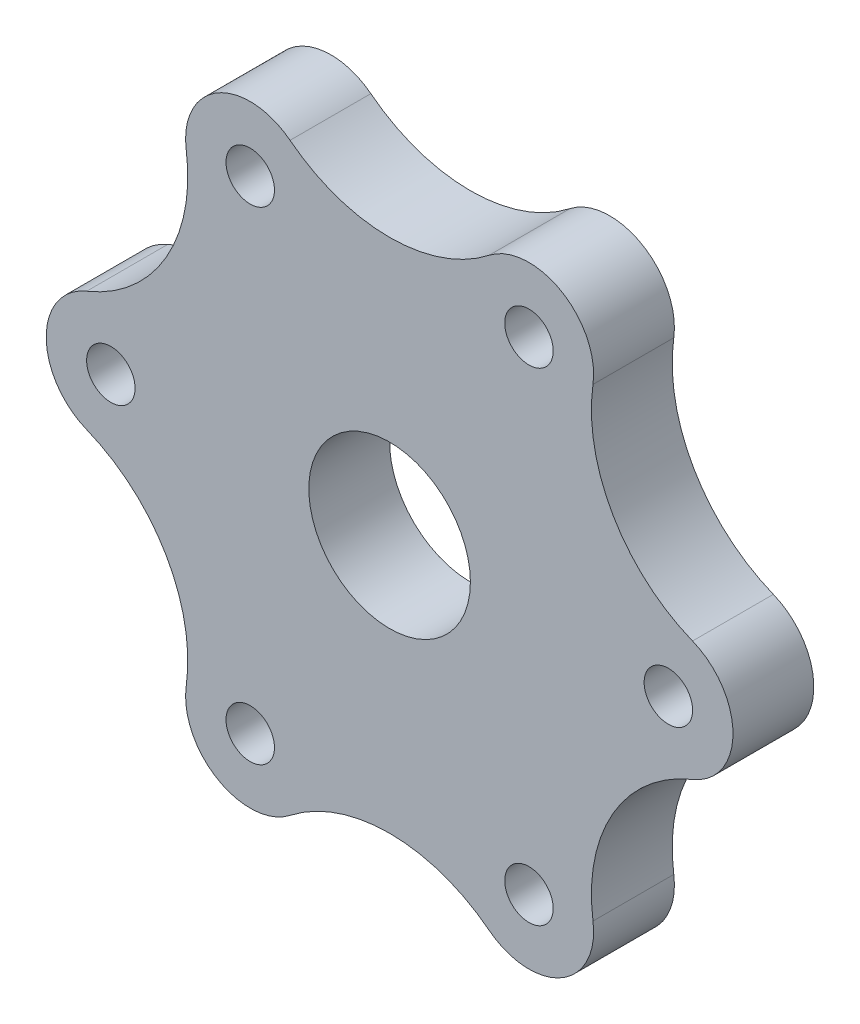
ISO-10303-21;
HEADER;
FILE_DESCRIPTION(('STEP AP214'),'2;1');
FILE_NAME('part.step','',(''),(''),'','','');
FILE_SCHEMA(('AUTOMOTIVE_DESIGN { 1 0 10303 214 1 1 1 1 }'));
ENDSEC;
DATA;
#1=APPLICATION_CONTEXT('core data for automotive mechanical design processes');
#2=APPLICATION_PROTOCOL_DEFINITION('international standard','automotive_design',2000,#1);
#3=PRODUCT_CONTEXT('',#1,'mechanical');
#4=PRODUCT('Part','Part','',(#3));
#5=PRODUCT_RELATED_PRODUCT_CATEGORY('part','',(#4));
#6=PRODUCT_DEFINITION_FORMATION('','',#4);
#7=PRODUCT_DEFINITION_CONTEXT('part definition',#1,'design');
#8=PRODUCT_DEFINITION('design','',#6,#7);
#9=PRODUCT_DEFINITION_SHAPE('','',#8);
#10=(LENGTH_UNIT() NAMED_UNIT(*) SI_UNIT(.MILLI.,.METRE.));
#11=(NAMED_UNIT(*) PLANE_ANGLE_UNIT() SI_UNIT($,.RADIAN.));
#12=(NAMED_UNIT(*) SI_UNIT($,.STERADIAN.) SOLID_ANGLE_UNIT());
#13=UNCERTAINTY_MEASURE_WITH_UNIT(LENGTH_MEASURE(1.E-05),#10,'distance_accuracy_value','');
#14=(GEOMETRIC_REPRESENTATION_CONTEXT(3) GLOBAL_UNCERTAINTY_ASSIGNED_CONTEXT((#13)) GLOBAL_UNIT_ASSIGNED_CONTEXT((#10,
#11,#12)) REPRESENTATION_CONTEXT('',''));
#15=CARTESIAN_POINT('',(0.,0.,0.));
#16=DIRECTION('',(0.,0.,1.));
#17=DIRECTION('',(1.,0.,0.));
#18=AXIS2_PLACEMENT_3D('',#15,#16,#17);
#19=CARTESIAN_POINT('',(8.62499999999937,40.9055405077826,5.));
#20=DIRECTION('',(0.,0.,1.));
#21=DIRECTION('',(1.,0.,0.));
#22=AXIS2_PLACEMENT_3D('',#19,#20,#21);
#23=PLANE('',#22);
#24=CARTESIAN_POINT('',(17.2499999999997,-29.8778764305633,5.));
#25=DIRECTION('',(0.,0.,1.));
#26=DIRECTION('',(1.,0.,0.));
#27=AXIS2_PLACEMENT_3D('',#24,#25,#26);
#28=CIRCLE('',#27,3.);
#29=CARTESIAN_POINT('',(20.2499999999997,-29.8778764305633,5.));
#30=VERTEX_POINT('',#29);
#31=EDGE_CURVE('E348',#30,#30,#28,.T.);
#32=ORIENTED_EDGE('',*,*,#31,.F.);
#33=EDGE_LOOP('',(#32));
#34=FACE_BOUND('',#33,.T.);
#35=CARTESIAN_POINT('',(17.2500000000001,29.8778764305631,5.));
#36=DIRECTION('',(0.,0.,1.));
#37=DIRECTION('',(1.,0.,0.));
#38=AXIS2_PLACEMENT_3D('',#35,#36,#37);
#39=CIRCLE('',#38,3.);
#40=CARTESIAN_POINT('',(20.2500000000001,29.8778764305631,5.));
#41=VERTEX_POINT('',#40);
#42=EDGE_CURVE('E364',#41,#41,#39,.T.);
#43=ORIENTED_EDGE('',*,*,#42,.F.);
#44=EDGE_LOOP('',(#43));
#45=FACE_BOUND('',#44,.T.);
#46=CARTESIAN_POINT('',(-34.5,0.,5.));
#47=DIRECTION('',(0.,0.,1.));
#48=DIRECTION('',(1.,0.,0.));
#49=AXIS2_PLACEMENT_3D('',#46,#47,#48);
#50=CIRCLE('',#49,3.);
#51=CARTESIAN_POINT('',(-31.5,0.,5.));
#52=VERTEX_POINT('',#51);
#53=EDGE_CURVE('E380',#52,#52,#50,.T.);
#54=ORIENTED_EDGE('',*,*,#53,.F.);
#55=EDGE_LOOP('',(#54));
#56=FACE_BOUND('',#55,.T.);
#57=CARTESIAN_POINT('',(-1.39788676991777E-12,51.9332045850022,5.));
#58=DIRECTION('',(0.,0.,-1.));
#59=DIRECTION('',(1.,0.,0.));
#60=AXIS2_PLACEMENT_3D('',#57,#58,#59);
#61=CIRCLE('',#60,20.);
#62=CARTESIAN_POINT('',(12.3214285714275,36.1793987604023,5.));
#63=VERTEX_POINT('',#62);
#64=CARTESIAN_POINT('',(-12.3214285714296,36.1793987604032,5.));
#65=VERTEX_POINT('',#64);
#66=EDGE_CURVE('E204',#63,#65,#61,.T.);
#67=ORIENTED_EDGE('',*,*,#66,.T.);
#68=CARTESIAN_POINT('',(-17.2499999999999,29.8778764305632,5.));
#69=DIRECTION('',(0.,0.,1.));
#70=DIRECTION('',(1.,0.,0.));
#71=AXIS2_PLACEMENT_3D('',#68,#69,#70);
#72=CIRCLE('',#71,7.99999999999949);
#73=CARTESIAN_POINT('',(-25.1715641344413,28.7603695339741,5.));
#74=VERTEX_POINT('',#73);
#75=EDGE_CURVE('E116',#65,#74,#72,.T.);
#76=ORIENTED_EDGE('',*,*,#75,.T.);
#77=CARTESIAN_POINT('',(-44.9754744705465,25.9666022925012,5.));
#78=DIRECTION('',(0.,0.,-1.));
#79=DIRECTION('',(1.,0.,0.));
#80=AXIS2_PLACEMENT_3D('',#77,#78,#79);
#81=CIRCLE('',#80,20.);
#82=CARTESIAN_POINT('',(-37.4929927058704,7.4190292264289,5.));
#83=VERTEX_POINT('',#82);
#84=EDGE_CURVE('E241',#74,#83,#81,.T.);
#85=ORIENTED_EDGE('',*,*,#84,.T.);
#86=CARTESIAN_POINT('',(-34.5,0.,5.));
#87=DIRECTION('',(0.,0.,1.));
#88=DIRECTION('',(1.,0.,0.));
#89=AXIS2_PLACEMENT_3D('',#86,#87,#88);
#90=CIRCLE('',#89,7.99999999999932);
#91=CARTESIAN_POINT('',(-37.4929927058702,-7.41902922642828,5.));
#92=VERTEX_POINT('',#91);
#93=EDGE_CURVE('E261',#83,#92,#90,.T.);
#94=ORIENTED_EDGE('',*,*,#93,.T.);
#95=CARTESIAN_POINT('',(-44.975474470546,-25.9666022924999,5.));
#96=DIRECTION('',(0.,0.,-1.));
#97=DIRECTION('',(1.,0.,0.));
#98=AXIS2_PLACEMENT_3D('',#95,#96,#97);
#99=CIRCLE('',#98,20.);
#100=CARTESIAN_POINT('',(-25.1715641344413,-28.7603695339727,5.));
#101=VERTEX_POINT('',#100);
#102=EDGE_CURVE('E257',#92,#101,#99,.T.);
#103=ORIENTED_EDGE('',*,*,#102,.T.);
#104=CARTESIAN_POINT('',(-17.2500000000004,-29.8778764305629,5.));
#105=DIRECTION('',(0.,0.,1.));
#106=DIRECTION('',(1.,0.,0.));
#107=AXIS2_PLACEMENT_3D('',#104,#105,#106);
#108=CIRCLE('',#107,7.99999999999981);
#109=CARTESIAN_POINT('',(-12.3214285714289,-36.1793987604025,5.));
#110=VERTEX_POINT('',#109);
#111=EDGE_CURVE('E260',#101,#110,#108,.T.);
#112=ORIENTED_EDGE('',*,*,#111,.T.);
#113=CARTESIAN_POINT('',(0.,-51.9332045850024,5.));
#114=DIRECTION('',(0.,0.,-1.));
#115=DIRECTION('',(1.,0.,0.));
#116=AXIS2_PLACEMENT_3D('',#113,#114,#115);
#117=CIRCLE('',#116,20.);
#118=CARTESIAN_POINT('',(12.3214285714286,-36.1793987604029,5.));
#119=VERTEX_POINT('',#118);
#120=EDGE_CURVE('E265',#110,#119,#117,.T.);
#121=ORIENTED_EDGE('',*,*,#120,.T.);
#122=CARTESIAN_POINT('',(17.2499999999997,-29.8778764305633,5.));
#123=DIRECTION('',(0.,0.,1.));
#124=DIRECTION('',(1.,0.,0.));
#125=AXIS2_PLACEMENT_3D('',#122,#123,#124);
#126=CIRCLE('',#125,7.99999999999999);
#127=CARTESIAN_POINT('',(25.1715641344416,-28.760369533974,5.));
#128=VERTEX_POINT('',#127);
#129=EDGE_CURVE('E272',#119,#128,#126,.T.);
#130=ORIENTED_EDGE('',*,*,#129,.T.);
#131=CARTESIAN_POINT('',(44.9754744705466,-25.9666022925011,5.));
#132=DIRECTION('',(0.,0.,-1.));
#133=DIRECTION('',(1.,0.,0.));
#134=AXIS2_PLACEMENT_3D('',#131,#132,#133);
#135=CIRCLE('',#134,20.);
#136=CARTESIAN_POINT('',(37.4929927058705,-7.41902922642887,5.));
#137=VERTEX_POINT('',#136);
#138=EDGE_CURVE('E147',#128,#137,#135,.T.);
#139=ORIENTED_EDGE('',*,*,#138,.T.);
#140=CARTESIAN_POINT('',(34.5,-2.40912212380176E-13,5.));
#141=DIRECTION('',(0.,0.,1.));
#142=DIRECTION('',(1.,0.,0.));
#143=AXIS2_PLACEMENT_3D('',#140,#141,#142);
#144=CIRCLE('',#143,8.00000000000001);
#145=CARTESIAN_POINT('',(37.4929927058703,7.41902922642871,5.));
#146=VERTEX_POINT('',#145);
#147=EDGE_CURVE('E141',#137,#146,#144,.T.);
#148=ORIENTED_EDGE('',*,*,#147,.T.);
#149=CARTESIAN_POINT('',(44.9754744705465,25.9666022925012,5.));
#150=DIRECTION('',(0.,0.,-1.));
#151=DIRECTION('',(1.,0.,0.));
#152=AXIS2_PLACEMENT_3D('',#149,#150,#151);
#153=CIRCLE('',#152,20.);
#154=CARTESIAN_POINT('',(25.1715641344419,28.760369533974,5.));
#155=VERTEX_POINT('',#154);
#156=EDGE_CURVE('E145',#146,#155,#153,.T.);
#157=ORIENTED_EDGE('',*,*,#156,.T.);
#158=CARTESIAN_POINT('',(17.2500000000001,29.8778764305631,5.));
#159=DIRECTION('',(0.,0.,1.));
#160=DIRECTION('',(1.,0.,0.));
#161=AXIS2_PLACEMENT_3D('',#158,#159,#160);
#162=CIRCLE('',#161,8.00000000000034);
#163=EDGE_CURVE('E61',#155,#63,#162,.T.);
#164=ORIENTED_EDGE('',*,*,#163,.T.);
#165=EDGE_LOOP('',(#67,#76,#85,#94,#103,#112,#121,#130,#139,#148,#157,#164));
#166=FACE_BOUND('',#165,.T.);
#167=CARTESIAN_POINT('',(0.,0.,5.));
#168=DIRECTION('',(0.,0.,1.));
#169=DIRECTION('',(1.,0.,0.));
#170=AXIS2_PLACEMENT_3D('',#167,#168,#169);
#171=CIRCLE('',#170,10.);
#172=CARTESIAN_POINT('',(10.,0.,5.));
#173=VERTEX_POINT('',#172);
#174=EDGE_CURVE('E174',#173,#173,#171,.T.);
#175=ORIENTED_EDGE('',*,*,#174,.F.);
#176=EDGE_LOOP('',(#175));
#177=FACE_BOUND('',#176,.T.);
#178=CARTESIAN_POINT('',(-17.25,29.8778764305631,5.));
#179=DIRECTION('',(0.,0.,1.));
#180=DIRECTION('',(1.,0.,0.));
#181=AXIS2_PLACEMENT_3D('',#178,#179,#180);
#182=CIRCLE('',#181,3.00000000000003);
#183=CARTESIAN_POINT('',(-14.25,29.8778764305631,5.));
#184=VERTEX_POINT('',#183);
#185=EDGE_CURVE('E372',#184,#184,#182,.T.);
#186=ORIENTED_EDGE('',*,*,#185,.F.);
#187=EDGE_LOOP('',(#186));
#188=FACE_BOUND('',#187,.T.);
#189=CARTESIAN_POINT('',(34.5,-2.40912212380176E-13,5.));
#190=DIRECTION('',(0.,0.,1.));
#191=DIRECTION('',(1.,0.,0.));
#192=AXIS2_PLACEMENT_3D('',#189,#190,#191);
#193=CIRCLE('',#192,3.);
#194=CARTESIAN_POINT('',(37.5,-2.40912212380176E-13,5.));
#195=VERTEX_POINT('',#194);
#196=EDGE_CURVE('E356',#195,#195,#193,.T.);
#197=ORIENTED_EDGE('',*,*,#196,.F.);
#198=EDGE_LOOP('',(#197));
#199=FACE_BOUND('',#198,.T.);
#200=CARTESIAN_POINT('',(-17.25,-29.8778764305631,5.));
#201=DIRECTION('',(0.,0.,1.));
#202=DIRECTION('',(1.,0.,0.));
#203=AXIS2_PLACEMENT_3D('',#200,#201,#202);
#204=CIRCLE('',#203,3.00000000000013);
#205=CARTESIAN_POINT('',(-14.2499999999998,-29.8778764305631,5.));
#206=VERTEX_POINT('',#205);
#207=EDGE_CURVE('E337',#206,#206,#204,.T.);
#208=ORIENTED_EDGE('',*,*,#207,.F.);
#209=EDGE_LOOP('',(#208));
#210=FACE_BOUND('',#209,.T.);
#211=ADVANCED_FACE('F43',(#34,#45,#56,#166,#177,#188,#199,#210),#23,.T.);
#212=CARTESIAN_POINT('',(8.62499999999937,40.9055405077826,-5.));
#213=DIRECTION('',(0.,0.,1.));
#214=DIRECTION('',(1.,0.,0.));
#215=AXIS2_PLACEMENT_3D('',#212,#213,#214);
#216=PLANE('',#215);
#217=CARTESIAN_POINT('',(-1.39788676991777E-12,51.9332045850022,-5.));
#218=DIRECTION('',(0.,0.,-1.));
#219=DIRECTION('',(1.,0.,0.));
#220=AXIS2_PLACEMENT_3D('',#217,#218,#219);
#221=CIRCLE('',#220,20.);
#222=CARTESIAN_POINT('',(12.3214285714275,36.1793987604023,-5.));
#223=VERTEX_POINT('',#222);
#224=CARTESIAN_POINT('',(-12.3214285714296,36.1793987604032,-5.));
#225=VERTEX_POINT('',#224);
#226=EDGE_CURVE('E169',#223,#225,#221,.T.);
#227=ORIENTED_EDGE('',*,*,#226,.F.);
#228=CARTESIAN_POINT('',(17.2500000000001,29.8778764305631,-5.));
#229=DIRECTION('',(0.,0.,1.));
#230=DIRECTION('',(1.,0.,0.));
#231=AXIS2_PLACEMENT_3D('',#228,#229,#230);
#232=CIRCLE('',#231,8.00000000000034);
#233=CARTESIAN_POINT('',(25.1715641344419,28.760369533974,-5.));
#234=VERTEX_POINT('',#233);
#235=EDGE_CURVE('E108',#234,#223,#232,.T.);
#236=ORIENTED_EDGE('',*,*,#235,.F.);
#237=CARTESIAN_POINT('',(44.9754744705465,25.9666022925012,-5.));
#238=DIRECTION('',(0.,0.,-1.));
#239=DIRECTION('',(1.,0.,0.));
#240=AXIS2_PLACEMENT_3D('',#237,#238,#239);
#241=CIRCLE('',#240,20.);
#242=CARTESIAN_POINT('',(37.4929927058703,7.41902922642871,-5.));
#243=VERTEX_POINT('',#242);
#244=EDGE_CURVE('E102',#243,#234,#241,.T.);
#245=ORIENTED_EDGE('',*,*,#244,.F.);
#246=CARTESIAN_POINT('',(34.5,-2.40912212380176E-13,-5.));
#247=DIRECTION('',(0.,0.,1.));
#248=DIRECTION('',(1.,0.,0.));
#249=AXIS2_PLACEMENT_3D('',#246,#247,#248);
#250=CIRCLE('',#249,8.00000000000001);
#251=CARTESIAN_POINT('',(37.4929927058705,-7.41902922642887,-5.));
#252=VERTEX_POINT('',#251);
#253=EDGE_CURVE('E156',#252,#243,#250,.T.);
#254=ORIENTED_EDGE('',*,*,#253,.F.);
#255=CARTESIAN_POINT('',(44.9754744705466,-25.9666022925011,-5.));
#256=DIRECTION('',(0.,0.,-1.));
#257=DIRECTION('',(1.,0.,0.));
#258=AXIS2_PLACEMENT_3D('',#255,#256,#257);
#259=CIRCLE('',#258,20.);
#260=CARTESIAN_POINT('',(25.1715641344416,-28.760369533974,-5.));
#261=VERTEX_POINT('',#260);
#262=EDGE_CURVE('E195',#261,#252,#259,.T.);
#263=ORIENTED_EDGE('',*,*,#262,.F.);
#264=CARTESIAN_POINT('',(17.2499999999997,-29.8778764305633,-5.));
#265=DIRECTION('',(0.,0.,1.));
#266=DIRECTION('',(1.,0.,0.));
#267=AXIS2_PLACEMENT_3D('',#264,#265,#266);
#268=CIRCLE('',#267,7.99999999999999);
#269=CARTESIAN_POINT('',(12.3214285714286,-36.1793987604029,-5.));
#270=VERTEX_POINT('',#269);
#271=EDGE_CURVE('E192',#270,#261,#268,.T.);
#272=ORIENTED_EDGE('',*,*,#271,.F.);
#273=CARTESIAN_POINT('',(0.,-51.9332045850024,-5.));
#274=DIRECTION('',(0.,0.,-1.));
#275=DIRECTION('',(1.,0.,0.));
#276=AXIS2_PLACEMENT_3D('',#273,#274,#275);
#277=CIRCLE('',#276,20.);
#278=CARTESIAN_POINT('',(-12.3214285714289,-36.1793987604025,-5.));
#279=VERTEX_POINT('',#278);
#280=EDGE_CURVE('E189',#279,#270,#277,.T.);
#281=ORIENTED_EDGE('',*,*,#280,.F.);
#282=CARTESIAN_POINT('',(-17.2500000000004,-29.8778764305629,-5.));
#283=DIRECTION('',(0.,0.,1.));
#284=DIRECTION('',(1.,0.,0.));
#285=AXIS2_PLACEMENT_3D('',#282,#283,#284);
#286=CIRCLE('',#285,7.99999999999981);
#287=CARTESIAN_POINT('',(-25.1715641344413,-28.7603695339727,-5.));
#288=VERTEX_POINT('',#287);
#289=EDGE_CURVE('E186',#288,#279,#286,.T.);
#290=ORIENTED_EDGE('',*,*,#289,.F.);
#291=CARTESIAN_POINT('',(-44.975474470546,-25.9666022924999,-5.));
#292=DIRECTION('',(0.,0.,-1.));
#293=DIRECTION('',(1.,0.,0.));
#294=AXIS2_PLACEMENT_3D('',#291,#292,#293);
#295=CIRCLE('',#294,20.);
#296=CARTESIAN_POINT('',(-37.4929927058702,-7.41902922642828,-5.));
#297=VERTEX_POINT('',#296);
#298=EDGE_CURVE('E183',#297,#288,#295,.T.);
#299=ORIENTED_EDGE('',*,*,#298,.F.);
#300=CARTESIAN_POINT('',(-34.5,0.,-5.));
#301=DIRECTION('',(0.,0.,1.));
#302=DIRECTION('',(1.,0.,0.));
#303=AXIS2_PLACEMENT_3D('',#300,#301,#302);
#304=CIRCLE('',#303,7.99999999999932);
#305=CARTESIAN_POINT('',(-37.4929927058704,7.4190292264289,-5.));
#306=VERTEX_POINT('',#305);
#307=EDGE_CURVE('E180',#306,#297,#304,.T.);
#308=ORIENTED_EDGE('',*,*,#307,.F.);
#309=CARTESIAN_POINT('',(-44.9754744705465,25.9666022925012,-5.));
#310=DIRECTION('',(0.,0.,-1.));
#311=DIRECTION('',(1.,0.,0.));
#312=AXIS2_PLACEMENT_3D('',#309,#310,#311);
#313=CIRCLE('',#312,20.);
#314=CARTESIAN_POINT('',(-25.1715641344413,28.7603695339741,-5.));
#315=VERTEX_POINT('',#314);
#316=EDGE_CURVE('E177',#315,#306,#313,.T.);
#317=ORIENTED_EDGE('',*,*,#316,.F.);
#318=CARTESIAN_POINT('',(-17.2499999999999,29.8778764305632,-5.));
#319=DIRECTION('',(0.,0.,1.));
#320=DIRECTION('',(1.,0.,0.));
#321=AXIS2_PLACEMENT_3D('',#318,#319,#320);
#322=CIRCLE('',#321,7.99999999999949);
#323=EDGE_CURVE('E173',#225,#315,#322,.T.);
#324=ORIENTED_EDGE('',*,*,#323,.F.);
#325=EDGE_LOOP('',(#227,#236,#245,#254,#263,#272,#281,#290,#299,#308,#317,#324));
#326=FACE_BOUND('',#325,.T.);
#327=CARTESIAN_POINT('',(0.,0.,-5.));
#328=DIRECTION('',(0.,0.,1.));
#329=DIRECTION('',(1.,0.,0.));
#330=AXIS2_PLACEMENT_3D('',#327,#328,#329);
#331=CIRCLE('',#330,10.);
#332=CARTESIAN_POINT('',(10.,0.,-5.));
#333=VERTEX_POINT('',#332);
#334=EDGE_CURVE('E384',#333,#333,#331,.T.);
#335=ORIENTED_EDGE('',*,*,#334,.T.);
#336=EDGE_LOOP('',(#335));
#337=FACE_BOUND('',#336,.T.);
#338=CARTESIAN_POINT('',(-34.5,0.,-5.));
#339=DIRECTION('',(0.,0.,1.));
#340=DIRECTION('',(1.,0.,0.));
#341=AXIS2_PLACEMENT_3D('',#338,#339,#340);
#342=CIRCLE('',#341,3.);
#343=CARTESIAN_POINT('',(-31.5,0.,-5.));
#344=VERTEX_POINT('',#343);
#345=EDGE_CURVE('E376',#344,#344,#342,.T.);
#346=ORIENTED_EDGE('',*,*,#345,.T.);
#347=EDGE_LOOP('',(#346));
#348=FACE_BOUND('',#347,.T.);
#349=CARTESIAN_POINT('',(-17.25,29.8778764305631,-5.));
#350=DIRECTION('',(0.,0.,1.));
#351=DIRECTION('',(1.,0.,0.));
#352=AXIS2_PLACEMENT_3D('',#349,#350,#351);
#353=CIRCLE('',#352,3.00000000000003);
#354=CARTESIAN_POINT('',(-14.25,29.8778764305631,-5.));
#355=VERTEX_POINT('',#354);
#356=EDGE_CURVE('E368',#355,#355,#353,.T.);
#357=ORIENTED_EDGE('',*,*,#356,.T.);
#358=EDGE_LOOP('',(#357));
#359=FACE_BOUND('',#358,.T.);
#360=CARTESIAN_POINT('',(17.2500000000001,29.8778764305631,-5.));
#361=DIRECTION('',(0.,0.,1.));
#362=DIRECTION('',(1.,0.,0.));
#363=AXIS2_PLACEMENT_3D('',#360,#361,#362);
#364=CIRCLE('',#363,3.);
#365=CARTESIAN_POINT('',(20.2500000000001,29.8778764305631,-5.));
#366=VERTEX_POINT('',#365);
#367=EDGE_CURVE('E360',#366,#366,#364,.T.);
#368=ORIENTED_EDGE('',*,*,#367,.T.);
#369=EDGE_LOOP('',(#368));
#370=FACE_BOUND('',#369,.T.);
#371=CARTESIAN_POINT('',(34.5,-2.40912212380176E-13,-5.));
#372=DIRECTION('',(0.,0.,1.));
#373=DIRECTION('',(1.,0.,0.));
#374=AXIS2_PLACEMENT_3D('',#371,#372,#373);
#375=CIRCLE('',#374,3.);
#376=CARTESIAN_POINT('',(37.5,-2.40912212380176E-13,-5.));
#377=VERTEX_POINT('',#376);
#378=EDGE_CURVE('E352',#377,#377,#375,.T.);
#379=ORIENTED_EDGE('',*,*,#378,.T.);
#380=EDGE_LOOP('',(#379));
#381=FACE_BOUND('',#380,.T.);
#382=CARTESIAN_POINT('',(17.2499999999997,-29.8778764305633,-5.));
#383=DIRECTION('',(0.,0.,1.));
#384=DIRECTION('',(1.,0.,0.));
#385=AXIS2_PLACEMENT_3D('',#382,#383,#384);
#386=CIRCLE('',#385,3.);
#387=CARTESIAN_POINT('',(20.2499999999997,-29.8778764305633,-5.));
#388=VERTEX_POINT('',#387);
#389=EDGE_CURVE('E345',#388,#388,#386,.T.);
#390=ORIENTED_EDGE('',*,*,#389,.T.);
#391=EDGE_LOOP('',(#390));
#392=FACE_BOUND('',#391,.T.);
#393=CARTESIAN_POINT('',(-17.25,-29.8778764305631,-5.));
#394=DIRECTION('',(0.,0.,1.));
#395=DIRECTION('',(1.,0.,0.));
#396=AXIS2_PLACEMENT_3D('',#393,#394,#395);
#397=CIRCLE('',#396,3.00000000000013);
#398=CARTESIAN_POINT('',(-14.2499999999998,-29.8778764305631,-5.));
#399=VERTEX_POINT('',#398);
#400=EDGE_CURVE('E340',#399,#399,#397,.T.);
#401=ORIENTED_EDGE('',*,*,#400,.T.);
#402=EDGE_LOOP('',(#401));
#403=FACE_BOUND('',#402,.T.);
#404=ADVANCED_FACE('F245',(#326,#337,#348,#359,#370,#381,#392,#403),#216,.F.);
#405=CARTESIAN_POINT('',(-1.39788676991777E-12,51.9332045850022,5.));
#406=DIRECTION('',(0.,0.,-1.));
#407=DIRECTION('',(-1.,0.,0.));
#408=AXIS2_PLACEMENT_3D('',#405,#406,#407);
#409=CYLINDRICAL_SURFACE('',#408,20.);
#410=ORIENTED_EDGE('',*,*,#226,.T.);
#411=DIRECTION('',(0.,0.,-1.));
#412=VECTOR('',#411,1.);
#413=CARTESIAN_POINT('',(-12.3214285714296,36.1793987604032,5.));
#414=LINE('',#413,#412);
#415=EDGE_CURVE('E11',#65,#225,#414,.T.);
#416=ORIENTED_EDGE('',*,*,#415,.F.);
#417=ORIENTED_EDGE('',*,*,#66,.F.);
#418=DIRECTION('',(0.,0.,-1.));
#419=VECTOR('',#418,1.);
#420=CARTESIAN_POINT('',(12.3214285714275,36.1793987604023,5.));
#421=LINE('',#420,#419);
#422=EDGE_CURVE('E165',#63,#223,#421,.T.);
#423=ORIENTED_EDGE('',*,*,#422,.T.);
#424=EDGE_LOOP('',(#410,#416,#417,#423));
#425=FACE_BOUND('',#424,.T.);
#426=ADVANCED_FACE('F45',(#425),#409,.F.);
#427=CARTESIAN_POINT('',(-17.2499999999999,29.8778764305632,5.));
#428=DIRECTION('',(0.,0.,-1.));
#429=DIRECTION('',(-1.,0.,0.));
#430=AXIS2_PLACEMENT_3D('',#427,#428,#429);
#431=CYLINDRICAL_SURFACE('',#430,7.99999999999949);
#432=ORIENTED_EDGE('',*,*,#323,.T.);
#433=DIRECTION('',(0.,0.,-1.));
#434=VECTOR('',#433,1.);
#435=CARTESIAN_POINT('',(-25.1715641344413,28.7603695339741,5.));
#436=LINE('',#435,#434);
#437=EDGE_CURVE('E53',#74,#315,#436,.T.);
#438=ORIENTED_EDGE('',*,*,#437,.F.);
#439=ORIENTED_EDGE('',*,*,#75,.F.);
#440=ORIENTED_EDGE('',*,*,#415,.T.);
#441=EDGE_LOOP('',(#432,#438,#439,#440));
#442=FACE_BOUND('',#441,.T.);
#443=ADVANCED_FACE('F537',(#442),#431,.T.);
#444=CARTESIAN_POINT('',(-44.9754744705465,25.9666022925012,5.));
#445=DIRECTION('',(0.,0.,-1.));
#446=DIRECTION('',(-1.,0.,0.));
#447=AXIS2_PLACEMENT_3D('',#444,#445,#446);
#448=CYLINDRICAL_SURFACE('',#447,20.);
#449=ORIENTED_EDGE('',*,*,#316,.T.);
#450=DIRECTION('',(0.,0.,-1.));
#451=VECTOR('',#450,1.);
#452=CARTESIAN_POINT('',(-37.4929927058704,7.4190292264289,5.));
#453=LINE('',#452,#451);
#454=EDGE_CURVE('E231',#83,#306,#453,.T.);
#455=ORIENTED_EDGE('',*,*,#454,.F.);
#456=ORIENTED_EDGE('',*,*,#84,.F.);
#457=ORIENTED_EDGE('',*,*,#437,.T.);
#458=EDGE_LOOP('',(#449,#455,#456,#457));
#459=FACE_BOUND('',#458,.T.);
#460=ADVANCED_FACE('F239',(#459),#448,.F.);
#461=CARTESIAN_POINT('',(-34.5,0.,5.));
#462=DIRECTION('',(0.,0.,-1.));
#463=DIRECTION('',(-1.,0.,0.));
#464=AXIS2_PLACEMENT_3D('',#461,#462,#463);
#465=CYLINDRICAL_SURFACE('',#464,7.99999999999932);
#466=ORIENTED_EDGE('',*,*,#307,.T.);
#467=DIRECTION('',(0.,0.,-1.));
#468=VECTOR('',#467,1.);
#469=CARTESIAN_POINT('',(-37.4929927058702,-7.41902922642828,5.));
#470=LINE('',#469,#468);
#471=EDGE_CURVE('E227',#92,#297,#470,.T.);
#472=ORIENTED_EDGE('',*,*,#471,.F.);
#473=ORIENTED_EDGE('',*,*,#93,.F.);
#474=ORIENTED_EDGE('',*,*,#454,.T.);
#475=EDGE_LOOP('',(#466,#472,#473,#474));
#476=FACE_BOUND('',#475,.T.);
#477=ADVANCED_FACE('F251',(#476),#465,.T.);
#478=CARTESIAN_POINT('',(-44.975474470546,-25.9666022924999,5.));
#479=DIRECTION('',(0.,0.,-1.));
#480=DIRECTION('',(-1.,0.,0.));
#481=AXIS2_PLACEMENT_3D('',#478,#479,#480);
#482=CYLINDRICAL_SURFACE('',#481,20.);
#483=ORIENTED_EDGE('',*,*,#298,.T.);
#484=DIRECTION('',(0.,0.,-1.));
#485=VECTOR('',#484,1.);
#486=CARTESIAN_POINT('',(-25.1715641344413,-28.7603695339727,5.));
#487=LINE('',#486,#485);
#488=EDGE_CURVE('E223',#101,#288,#487,.T.);
#489=ORIENTED_EDGE('',*,*,#488,.F.);
#490=ORIENTED_EDGE('',*,*,#102,.F.);
#491=ORIENTED_EDGE('',*,*,#471,.T.);
#492=EDGE_LOOP('',(#483,#489,#490,#491));
#493=FACE_BOUND('',#492,.T.);
#494=ADVANCED_FACE('F255',(#493),#482,.F.);
#495=CARTESIAN_POINT('',(-17.2500000000004,-29.8778764305629,5.));
#496=DIRECTION('',(0.,0.,-1.));
#497=DIRECTION('',(-1.,0.,0.));
#498=AXIS2_PLACEMENT_3D('',#495,#496,#497);
#499=CYLINDRICAL_SURFACE('',#498,7.99999999999981);
#500=ORIENTED_EDGE('',*,*,#289,.T.);
#501=DIRECTION('',(0.,0.,-1.));
#502=VECTOR('',#501,1.);
#503=CARTESIAN_POINT('',(-12.3214285714289,-36.1793987604025,5.));
#504=LINE('',#503,#502);
#505=EDGE_CURVE('E219',#110,#279,#504,.T.);
#506=ORIENTED_EDGE('',*,*,#505,.F.);
#507=ORIENTED_EDGE('',*,*,#111,.F.);
#508=ORIENTED_EDGE('',*,*,#488,.T.);
#509=EDGE_LOOP('',(#500,#506,#507,#508));
#510=FACE_BOUND('',#509,.T.);
#511=ADVANCED_FACE('F498',(#510),#499,.T.);
#512=CARTESIAN_POINT('',(0.,-51.9332045850024,5.));
#513=DIRECTION('',(0.,0.,-1.));
#514=DIRECTION('',(-1.,0.,0.));
#515=AXIS2_PLACEMENT_3D('',#512,#513,#514);
#516=CYLINDRICAL_SURFACE('',#515,20.);
#517=ORIENTED_EDGE('',*,*,#280,.T.);
#518=DIRECTION('',(0.,0.,-1.));
#519=VECTOR('',#518,1.);
#520=CARTESIAN_POINT('',(12.3214285714286,-36.1793987604029,5.));
#521=LINE('',#520,#519);
#522=EDGE_CURVE('E215',#119,#270,#521,.T.);
#523=ORIENTED_EDGE('',*,*,#522,.F.);
#524=ORIENTED_EDGE('',*,*,#120,.F.);
#525=ORIENTED_EDGE('',*,*,#505,.T.);
#526=EDGE_LOOP('',(#517,#523,#524,#525));
#527=FACE_BOUND('',#526,.T.);
#528=ADVANCED_FACE('F488',(#527),#516,.F.);
#529=CARTESIAN_POINT('',(17.2499999999997,-29.8778764305633,5.));
#530=DIRECTION('',(0.,0.,-1.));
#531=DIRECTION('',(-1.,0.,0.));
#532=AXIS2_PLACEMENT_3D('',#529,#530,#531);
#533=CYLINDRICAL_SURFACE('',#532,7.99999999999999);
#534=ORIENTED_EDGE('',*,*,#271,.T.);
#535=DIRECTION('',(0.,0.,-1.));
#536=VECTOR('',#535,1.);
#537=CARTESIAN_POINT('',(25.1715641344416,-28.760369533974,5.));
#538=LINE('',#537,#536);
#539=EDGE_CURVE('E211',#128,#261,#538,.T.);
#540=ORIENTED_EDGE('',*,*,#539,.F.);
#541=ORIENTED_EDGE('',*,*,#129,.F.);
#542=ORIENTED_EDGE('',*,*,#522,.T.);
#543=EDGE_LOOP('',(#534,#540,#541,#542));
#544=FACE_BOUND('',#543,.T.);
#545=ADVANCED_FACE('F280',(#544),#533,.T.);
#546=CARTESIAN_POINT('',(44.9754744705466,-25.9666022925011,5.));
#547=DIRECTION('',(0.,0.,-1.));
#548=DIRECTION('',(-1.,0.,0.));
#549=AXIS2_PLACEMENT_3D('',#546,#547,#548);
#550=CYLINDRICAL_SURFACE('',#549,20.);
#551=ORIENTED_EDGE('',*,*,#262,.T.);
#552=DIRECTION('',(0.,0.,-1.));
#553=VECTOR('',#552,1.);
#554=CARTESIAN_POINT('',(37.4929927058705,-7.41902922642887,5.));
#555=LINE('',#554,#553);
#556=EDGE_CURVE('E158',#137,#252,#555,.T.);
#557=ORIENTED_EDGE('',*,*,#556,.F.);
#558=ORIENTED_EDGE('',*,*,#138,.F.);
#559=ORIENTED_EDGE('',*,*,#539,.T.);
#560=EDGE_LOOP('',(#551,#557,#558,#559));
#561=FACE_BOUND('',#560,.T.);
#562=ADVANCED_FACE('F284',(#561),#550,.F.);
#563=CARTESIAN_POINT('',(34.5,-2.40912212380176E-13,5.));
#564=DIRECTION('',(0.,0.,-1.));
#565=DIRECTION('',(-1.,0.,0.));
#566=AXIS2_PLACEMENT_3D('',#563,#564,#565);
#567=CYLINDRICAL_SURFACE('',#566,8.00000000000001);
#568=ORIENTED_EDGE('',*,*,#253,.T.);
#569=DIRECTION('',(0.,0.,-1.));
#570=VECTOR('',#569,1.);
#571=CARTESIAN_POINT('',(37.4929927058703,7.41902922642871,5.));
#572=LINE('',#571,#570);
#573=EDGE_CURVE('E153',#146,#243,#572,.T.);
#574=ORIENTED_EDGE('',*,*,#573,.F.);
#575=ORIENTED_EDGE('',*,*,#147,.F.);
#576=ORIENTED_EDGE('',*,*,#556,.T.);
#577=EDGE_LOOP('',(#568,#574,#575,#576));
#578=FACE_BOUND('',#577,.T.);
#579=ADVANCED_FACE('F154',(#578),#567,.T.);
#580=CARTESIAN_POINT('',(44.9754744705465,25.9666022925012,5.));
#581=DIRECTION('',(0.,0.,-1.));
#582=DIRECTION('',(-1.,0.,0.));
#583=AXIS2_PLACEMENT_3D('',#580,#581,#582);
#584=CYLINDRICAL_SURFACE('',#583,20.);
#585=ORIENTED_EDGE('',*,*,#244,.T.);
#586=DIRECTION('',(0.,0.,-1.));
#587=VECTOR('',#586,1.);
#588=CARTESIAN_POINT('',(25.1715641344419,28.760369533974,5.));
#589=LINE('',#588,#587);
#590=EDGE_CURVE('E159',#155,#234,#589,.T.);
#591=ORIENTED_EDGE('',*,*,#590,.F.);
#592=ORIENTED_EDGE('',*,*,#156,.F.);
#593=ORIENTED_EDGE('',*,*,#573,.T.);
#594=EDGE_LOOP('',(#585,#591,#592,#593));
#595=FACE_BOUND('',#594,.T.);
#596=ADVANCED_FACE('F161',(#595),#584,.F.);
#597=CARTESIAN_POINT('',(17.2500000000001,29.8778764305631,5.));
#598=DIRECTION('',(0.,0.,-1.));
#599=DIRECTION('',(-1.,0.,0.));
#600=AXIS2_PLACEMENT_3D('',#597,#598,#599);
#601=CYLINDRICAL_SURFACE('',#600,8.00000000000034);
#602=ORIENTED_EDGE('',*,*,#235,.T.);
#603=ORIENTED_EDGE('',*,*,#422,.F.);
#604=ORIENTED_EDGE('',*,*,#163,.F.);
#605=ORIENTED_EDGE('',*,*,#590,.T.);
#606=EDGE_LOOP('',(#602,#603,#604,#605));
#607=FACE_BOUND('',#606,.T.);
#608=ADVANCED_FACE('F288',(#607),#601,.T.);
#609=CARTESIAN_POINT('',(0.,0.,5.));
#610=DIRECTION('',(0.,0.,-1.));
#611=DIRECTION('',(-1.,0.,0.));
#612=AXIS2_PLACEMENT_3D('',#609,#610,#611);
#613=CYLINDRICAL_SURFACE('',#612,10.);
#614=ORIENTED_EDGE('',*,*,#174,.T.);
#615=EDGE_LOOP('',(#614));
#616=FACE_BOUND('',#615,.T.);
#617=ORIENTED_EDGE('',*,*,#334,.F.);
#618=EDGE_LOOP('',(#617));
#619=FACE_BOUND('',#618,.T.);
#620=ADVANCED_FACE('F290',(#616,#619),#613,.F.);
#621=CARTESIAN_POINT('',(-34.5,0.,5.));
#622=DIRECTION('',(0.,0.,-1.));
#623=DIRECTION('',(-1.,0.,0.));
#624=AXIS2_PLACEMENT_3D('',#621,#622,#623);
#625=CYLINDRICAL_SURFACE('',#624,3.);
#626=ORIENTED_EDGE('',*,*,#53,.T.);
#627=EDGE_LOOP('',(#626));
#628=FACE_BOUND('',#627,.T.);
#629=ORIENTED_EDGE('',*,*,#345,.F.);
#630=EDGE_LOOP('',(#629));
#631=FACE_BOUND('',#630,.T.);
#632=ADVANCED_FACE('F296',(#628,#631),#625,.F.);
#633=CARTESIAN_POINT('',(-17.25,29.8778764305631,5.));
#634=DIRECTION('',(0.,0.,-1.));
#635=DIRECTION('',(-1.,0.,0.));
#636=AXIS2_PLACEMENT_3D('',#633,#634,#635);
#637=CYLINDRICAL_SURFACE('',#636,3.00000000000003);
#638=ORIENTED_EDGE('',*,*,#185,.T.);
#639=EDGE_LOOP('',(#638));
#640=FACE_BOUND('',#639,.T.);
#641=ORIENTED_EDGE('',*,*,#356,.F.);
#642=EDGE_LOOP('',(#641));
#643=FACE_BOUND('',#642,.T.);
#644=ADVANCED_FACE('F312',(#640,#643),#637,.F.);
#645=CARTESIAN_POINT('',(17.2500000000001,29.8778764305631,5.));
#646=DIRECTION('',(0.,0.,-1.));
#647=DIRECTION('',(-1.,0.,0.));
#648=AXIS2_PLACEMENT_3D('',#645,#646,#647);
#649=CYLINDRICAL_SURFACE('',#648,3.);
#650=ORIENTED_EDGE('',*,*,#42,.T.);
#651=EDGE_LOOP('',(#650));
#652=FACE_BOUND('',#651,.T.);
#653=ORIENTED_EDGE('',*,*,#367,.F.);
#654=EDGE_LOOP('',(#653));
#655=FACE_BOUND('',#654,.T.);
#656=ADVANCED_FACE('F316',(#652,#655),#649,.F.);
#657=CARTESIAN_POINT('',(34.5,-2.40912212380176E-13,5.));
#658=DIRECTION('',(0.,0.,-1.));
#659=DIRECTION('',(-1.,0.,0.));
#660=AXIS2_PLACEMENT_3D('',#657,#658,#659);
#661=CYLINDRICAL_SURFACE('',#660,3.);
#662=ORIENTED_EDGE('',*,*,#196,.T.);
#663=EDGE_LOOP('',(#662));
#664=FACE_BOUND('',#663,.T.);
#665=ORIENTED_EDGE('',*,*,#378,.F.);
#666=EDGE_LOOP('',(#665));
#667=FACE_BOUND('',#666,.T.);
#668=ADVANCED_FACE('F320',(#664,#667),#661,.F.);
#669=CARTESIAN_POINT('',(17.2499999999997,-29.8778764305633,5.));
#670=DIRECTION('',(0.,0.,-1.));
#671=DIRECTION('',(-1.,0.,0.));
#672=AXIS2_PLACEMENT_3D('',#669,#670,#671);
#673=CYLINDRICAL_SURFACE('',#672,3.);
#674=ORIENTED_EDGE('',*,*,#31,.T.);
#675=EDGE_LOOP('',(#674));
#676=FACE_BOUND('',#675,.T.);
#677=ORIENTED_EDGE('',*,*,#389,.F.);
#678=EDGE_LOOP('',(#677));
#679=FACE_BOUND('',#678,.T.);
#680=ADVANCED_FACE('F324',(#676,#679),#673,.F.);
#681=CARTESIAN_POINT('',(-17.25,-29.8778764305631,5.));
#682=DIRECTION('',(0.,0.,-1.));
#683=DIRECTION('',(-1.,0.,0.));
#684=AXIS2_PLACEMENT_3D('',#681,#682,#683);
#685=CYLINDRICAL_SURFACE('',#684,3.00000000000013);
#686=ORIENTED_EDGE('',*,*,#207,.T.);
#687=EDGE_LOOP('',(#686));
#688=FACE_BOUND('',#687,.T.);
#689=ORIENTED_EDGE('',*,*,#400,.F.);
#690=EDGE_LOOP('',(#689));
#691=FACE_BOUND('',#690,.T.);
#692=ADVANCED_FACE('F328',(#688,#691),#685,.F.);
#693=CLOSED_SHELL('',(#211,#404,#426,#443,#460,#477,#494,#511,#528,#545,#562,#579,#596,#608,
#620,#632,#644,#656,#668,#680,#692));
#694=MANIFOLD_SOLID_BREP('B2',#693);
#695=ADVANCED_BREP_SHAPE_REPRESENTATION('',(#18,#694),#14);
#696=SHAPE_DEFINITION_REPRESENTATION(#9,#695);
ENDSEC;
END-ISO-10303-21;
